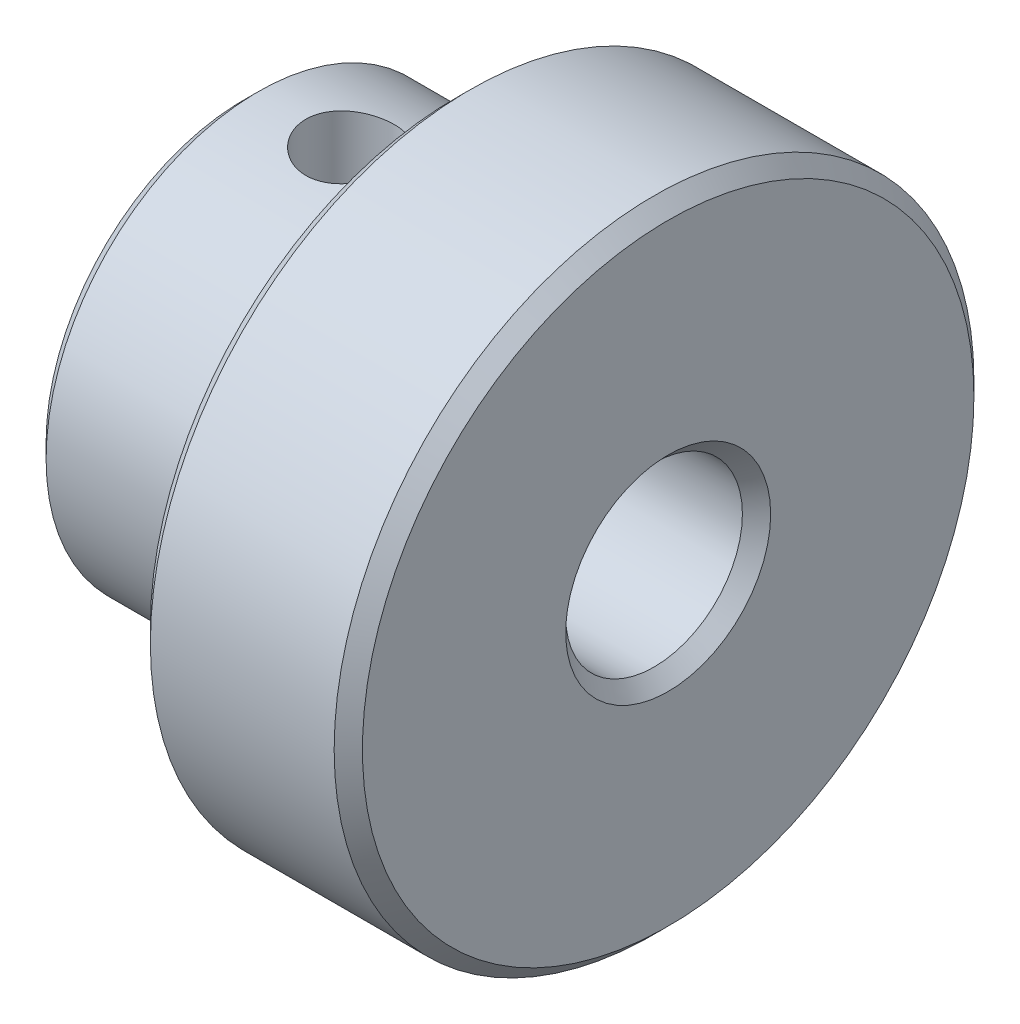
ISO-10303-21;
HEADER;
FILE_DESCRIPTION(('STEP AP214'),'2;1');
FILE_NAME('part.step','',(''),(''),'','','');
FILE_SCHEMA(('AUTOMOTIVE_DESIGN { 1 0 10303 214 1 1 1 1 }'));
ENDSEC;
DATA;
#1=APPLICATION_CONTEXT('core data for automotive mechanical design processes');
#2=APPLICATION_PROTOCOL_DEFINITION('international standard','automotive_design',2000,#1);
#3=PRODUCT_CONTEXT('',#1,'mechanical');
#4=PRODUCT('Part','Part','',(#3));
#5=PRODUCT_RELATED_PRODUCT_CATEGORY('part','',(#4));
#6=PRODUCT_DEFINITION_FORMATION('','',#4);
#7=PRODUCT_DEFINITION_CONTEXT('part definition',#1,'design');
#8=PRODUCT_DEFINITION('design','',#6,#7);
#9=PRODUCT_DEFINITION_SHAPE('','',#8);
#10=(LENGTH_UNIT() NAMED_UNIT(*) SI_UNIT(.MILLI.,.METRE.));
#11=(NAMED_UNIT(*) PLANE_ANGLE_UNIT() SI_UNIT($,.RADIAN.));
#12=(NAMED_UNIT(*) SI_UNIT($,.STERADIAN.) SOLID_ANGLE_UNIT());
#13=UNCERTAINTY_MEASURE_WITH_UNIT(LENGTH_MEASURE(1.E-05),#10,'distance_accuracy_value','');
#14=(GEOMETRIC_REPRESENTATION_CONTEXT(3) GLOBAL_UNCERTAINTY_ASSIGNED_CONTEXT((#13)) GLOBAL_UNIT_ASSIGNED_CONTEXT((#10,
#11,#12)) REPRESENTATION_CONTEXT('',''));
#15=CARTESIAN_POINT('',(0.,0.,0.));
#16=DIRECTION('',(0.,0.,1.));
#17=DIRECTION('',(1.,0.,0.));
#18=AXIS2_PLACEMENT_3D('',#15,#16,#17);
#19=CARTESIAN_POINT('',(0.,0.,6.));
#20=DIRECTION('',(-1.,0.,0.));
#21=DIRECTION('',(0.,0.,1.));
#22=AXIS2_PLACEMENT_3D('',#19,#20,#21);
#23=PLANE('',#22);
#24=CARTESIAN_POINT('',(0.,0.,0.));
#25=DIRECTION('',(-1.,0.,0.));
#26=DIRECTION('',(0.,0.,1.));
#27=AXIS2_PLACEMENT_3D('',#24,#25,#26);
#28=CIRCLE('',#27,5.6);
#29=CARTESIAN_POINT('',(0.,0.,5.6));
#30=VERTEX_POINT('',#29);
#31=EDGE_CURVE('E26',#30,#30,#28,.T.);
#32=ORIENTED_EDGE('',*,*,#31,.T.);
#33=EDGE_LOOP('',(#32));
#34=FACE_BOUND('',#33,.T.);
#35=CARTESIAN_POINT('',(0.,0.,0.));
#36=DIRECTION('',(-1.,0.,0.));
#37=DIRECTION('',(0.,0.,1.));
#38=AXIS2_PLACEMENT_3D('',#35,#36,#37);
#39=CIRCLE('',#38,2.9);
#40=CARTESIAN_POINT('',(0.,0.,2.9));
#41=VERTEX_POINT('',#40);
#42=EDGE_CURVE('E30',#41,#41,#39,.F.);
#43=ORIENTED_EDGE('',*,*,#42,.T.);
#44=EDGE_LOOP('',(#43));
#45=FACE_BOUND('',#44,.T.);
#46=ADVANCED_FACE('F14',(#34,#45),#23,.T.);
#47=CARTESIAN_POINT('',(12.,0.,0.));
#48=DIRECTION('',(1.,0.,0.));
#49=DIRECTION('',(0.,0.,-1.));
#50=AXIS2_PLACEMENT_3D('',#47,#48,#49);
#51=PLANE('',#50);
#52=CARTESIAN_POINT('',(12.,0.,0.));
#53=DIRECTION('',(1.,0.,0.));
#54=DIRECTION('',(0.,0.,-1.));
#55=AXIS2_PLACEMENT_3D('',#52,#53,#54);
#56=CIRCLE('',#55,8.65);
#57=CARTESIAN_POINT('',(12.,0.,-8.65));
#58=VERTEX_POINT('',#57);
#59=EDGE_CURVE('E41',#58,#58,#56,.T.);
#60=ORIENTED_EDGE('',*,*,#59,.T.);
#61=EDGE_LOOP('',(#60));
#62=FACE_BOUND('',#61,.T.);
#63=CARTESIAN_POINT('',(12.,0.,0.));
#64=DIRECTION('',(1.,0.,0.));
#65=DIRECTION('',(0.,0.,-1.));
#66=AXIS2_PLACEMENT_3D('',#63,#64,#65);
#67=CIRCLE('',#66,2.9);
#68=CARTESIAN_POINT('',(12.,0.,-2.9));
#69=VERTEX_POINT('',#68);
#70=EDGE_CURVE('E44',#69,#69,#67,.F.);
#71=ORIENTED_EDGE('',*,*,#70,.T.);
#72=EDGE_LOOP('',(#71));
#73=FACE_BOUND('',#72,.T.);
#74=ADVANCED_FACE('F90',(#62,#73),#51,.T.);
#75=CARTESIAN_POINT('',(0.,0.,0.));
#76=DIRECTION('',(-1.,0.,0.));
#77=DIRECTION('',(0.,0.,1.));
#78=AXIS2_PLACEMENT_3D('',#75,#76,#77);
#79=CYLINDRICAL_SURFACE('',#78,9.05);
#80=CARTESIAN_POINT('',(11.6,0.,0.));
#81=DIRECTION('',(1.,0.,0.));
#82=DIRECTION('',(0.,0.,-1.));
#83=AXIS2_PLACEMENT_3D('',#80,#81,#82);
#84=CIRCLE('',#83,9.05);
#85=CARTESIAN_POINT('',(11.6,0.,-9.05));
#86=VERTEX_POINT('',#85);
#87=EDGE_CURVE('E47',#86,#86,#84,.F.);
#88=ORIENTED_EDGE('',*,*,#87,.T.);
#89=EDGE_LOOP('',(#88));
#90=FACE_BOUND('',#89,.T.);
#91=CARTESIAN_POINT('',(6.4,0.,0.));
#92=DIRECTION('',(-1.,0.,0.));
#93=DIRECTION('',(0.,0.,1.));
#94=AXIS2_PLACEMENT_3D('',#91,#92,#93);
#95=CIRCLE('',#94,9.05);
#96=CARTESIAN_POINT('',(6.4,0.,9.05));
#97=VERTEX_POINT('',#96);
#98=EDGE_CURVE('E50',#97,#97,#95,.F.);
#99=ORIENTED_EDGE('',*,*,#98,.T.);
#100=EDGE_LOOP('',(#99));
#101=FACE_BOUND('',#100,.T.);
#102=ADVANCED_FACE('F96',(#90,#101),#79,.T.);
#103=CARTESIAN_POINT('',(6.,0.,9.05));
#104=DIRECTION('',(-1.,0.,0.));
#105=DIRECTION('',(0.,0.,1.));
#106=AXIS2_PLACEMENT_3D('',#103,#104,#105);
#107=PLANE('',#106);
#108=CARTESIAN_POINT('',(6.,0.,0.));
#109=DIRECTION('',(-1.,0.,0.));
#110=DIRECTION('',(0.,0.,1.));
#111=AXIS2_PLACEMENT_3D('',#108,#109,#110);
#112=CIRCLE('',#111,8.65);
#113=CARTESIAN_POINT('',(6.,0.,8.65));
#114=VERTEX_POINT('',#113);
#115=EDGE_CURVE('E10',#114,#114,#112,.T.);
#116=ORIENTED_EDGE('',*,*,#115,.T.);
#117=EDGE_LOOP('',(#116));
#118=FACE_BOUND('',#117,.T.);
#119=CARTESIAN_POINT('',(6.,0.,0.));
#120=DIRECTION('',(-1.,0.,0.));
#121=DIRECTION('',(0.,0.,1.));
#122=AXIS2_PLACEMENT_3D('',#119,#120,#121);
#123=CIRCLE('',#122,6.);
#124=CARTESIAN_POINT('',(6.,0.,6.));
#125=VERTEX_POINT('',#124);
#126=EDGE_CURVE('E53',#125,#125,#123,.T.);
#127=ORIENTED_EDGE('',*,*,#126,.F.);
#128=EDGE_LOOP('',(#127));
#129=FACE_BOUND('',#128,.T.);
#130=ADVANCED_FACE('F87',(#118,#129),#107,.T.);
#131=CARTESIAN_POINT('',(0.,0.,0.));
#132=DIRECTION('',(-1.,0.,0.));
#133=DIRECTION('',(0.,0.,1.));
#134=AXIS2_PLACEMENT_3D('',#131,#132,#133);
#135=CYLINDRICAL_SURFACE('',#134,6.);
#136=CARTESIAN_POINT('',(0.400000000000008,0.,0.));
#137=DIRECTION('',(-1.,0.,0.));
#138=DIRECTION('',(0.,0.,1.));
#139=AXIS2_PLACEMENT_3D('',#136,#137,#138);
#140=CIRCLE('',#139,6.);
#141=CARTESIAN_POINT('',(0.400000000000008,0.,6.));
#142=VERTEX_POINT('',#141);
#143=EDGE_CURVE('E22',#142,#142,#140,.F.);
#144=ORIENTED_EDGE('',*,*,#143,.T.);
#145=EDGE_LOOP('',(#144));
#146=FACE_BOUND('',#145,.T.);
#147=CARTESIAN_POINT('',(3.,5.86834729715275,1.25));
#148=CARTESIAN_POINT('',(3.06939061515103,5.86834869213645,1.249997508776));
#149=CARTESIAN_POINT('',(3.13881197201522,5.86959145924544,1.24420229433948));
#150=CARTESIAN_POINT('',(3.27568631731725,5.87442015581798,1.22119649233779));
#151=CARTESIAN_POINT('',(3.34313775550642,5.87800788138388,1.20397715440341));
#152=CARTESIAN_POINT('',(3.47407237283487,5.8871029296193,1.1586839750723));
#153=CARTESIAN_POINT('',(3.53755959599181,5.89260825706945,1.13062141248932));
#154=CARTESIAN_POINT('',(3.6589244996456,5.90491581335741,1.06446988601732));
#155=CARTESIAN_POINT('',(3.71680240673001,5.91171798977623,1.02638132735819));
#156=CARTESIAN_POINT('',(3.82619537515346,5.92596934661468,0.940636399466077));
#157=CARTESIAN_POINT('',(3.87761189362647,5.93342614373039,0.892855554869669));
#158=CARTESIAN_POINT('',(3.9717610686481,5.94807966802575,0.789351223880638));
#159=CARTESIAN_POINT('',(4.01449308829144,5.95527637609915,0.733627155455999));
#160=CARTESIAN_POINT('',(4.09044588808286,5.96868135118849,0.615162052999585));
#161=CARTESIAN_POINT('',(4.12357252646326,5.97487958631243,0.552359428204941));
#162=CARTESIAN_POINT('',(4.17876605285978,5.98550347343302,0.421928551006721));
#163=CARTESIAN_POINT('',(4.20083406515352,5.98992930561222,0.35430078995059));
#164=CARTESIAN_POINT('',(4.23297576111746,5.99645589892178,0.2171629042005));
#165=CARTESIAN_POINT('',(4.24321601719517,5.99858891959926,0.147693380916357));
#166=CARTESIAN_POINT('',(4.25193169575702,6.00040112580612,0.0079918488395248));
#167=CARTESIAN_POINT('',(4.2504083441931,6.0000805670369,-0.0622400797368379));
#168=CARTESIAN_POINT('',(4.23576539904325,5.99704658090511,-0.200326586199572));
#169=CARTESIAN_POINT('',(4.22282528104188,5.99437018956584,-0.268201128726476));
#170=CARTESIAN_POINT('',(4.18600137466869,5.98696720898885,-0.400793746289752));
#171=CARTESIAN_POINT('',(4.16211712279692,5.98224053291904,-0.46551168751102));
#172=CARTESIAN_POINT('',(4.10391994787449,5.97120767323924,-0.590460005384682));
#173=CARTESIAN_POINT('',(4.06953770579034,5.96489104125346,-0.650657134981651));
#174=CARTESIAN_POINT('',(3.99137199715959,5.95137300440189,-0.764493456510648));
#175=CARTESIAN_POINT('',(3.94758736179387,5.94417148958325,-0.818131831816415));
#176=CARTESIAN_POINT('',(3.85087837510894,5.92951700233276,-0.918394203276908));
#177=CARTESIAN_POINT('',(3.79779694001806,5.92206184975925,-0.964866487494795));
#178=CARTESIAN_POINT('',(3.6845179510052,5.90786872648996,-1.04827597240488));
#179=CARTESIAN_POINT('',(3.62432023861276,5.9011307717716,-1.08521296069979));
#180=CARTESIAN_POINT('',(3.4982877451712,5.88912998409156,-1.14856217138454));
#181=CARTESIAN_POINT('',(3.43243934930657,5.88387085232125,-1.17494805489727));
#182=CARTESIAN_POINT('',(3.29710838063061,5.8754760641036,-1.21623577538673));
#183=CARTESIAN_POINT('',(3.22762632719191,5.87234010507183,-1.23113924882348));
#184=CARTESIAN_POINT('',(3.08838029368109,5.86860783239133,-1.24880863867017));
#185=CARTESIAN_POINT('',(3.01864541546297,5.86796551863474,-1.25179442917998));
#186=CARTESIAN_POINT('',(2.87967418845986,5.86916952018704,-1.24613693439294));
#187=CARTESIAN_POINT('',(2.81043780909767,5.87101568152624,-1.23749436857862));
#188=CARTESIAN_POINT('',(2.67517948394188,5.87694538226167,-1.20901558325483));
#189=CARTESIAN_POINT('',(2.60913133282117,5.88100511282998,-1.18929841376871));
#190=CARTESIAN_POINT('',(2.4812760105584,5.8908833850312,-1.13935810860919));
#191=CARTESIAN_POINT('',(2.4194692143496,5.89670208191057,-1.10913404556146));
#192=CARTESIAN_POINT('',(2.30089355878377,5.90954501937191,-1.03854598181484));
#193=CARTESIAN_POINT('',(2.24420779553383,5.91658506648323,-0.998045327353962));
#194=CARTESIAN_POINT('',(2.13835675084494,5.93103483993908,-0.908234440569879));
#195=CARTESIAN_POINT('',(2.08919231376078,5.93844460766532,-0.858923220505169));
#196=CARTESIAN_POINT('',(1.99893728690284,5.95294924316736,-0.751900450843335));
#197=CARTESIAN_POINT('',(1.95799590497362,5.9600367471991,-0.694061907614552));
#198=CARTESIAN_POINT('',(1.88641124791202,5.97296708772407,-0.572200102216361));
#199=CARTESIAN_POINT('',(1.85576751776256,5.97880997920819,-0.50817711347688));
#200=CARTESIAN_POINT('',(1.80586132068266,5.98856148270679,-0.376142117847917));
#201=CARTESIAN_POINT('',(1.78653083445566,5.99248163136497,-0.308156710970194));
#202=CARTESIAN_POINT('',(1.7595855959919,5.99799561410226,-0.169813400503473));
#203=CARTESIAN_POINT('',(1.75196930646727,5.99958975342888,-0.0994558094616957));
#204=CARTESIAN_POINT('',(1.74873237795149,6.00026408056941,0.0402133434703397));
#205=CARTESIAN_POINT('',(1.75288810000527,5.99939113754811,0.109519592177923));
#206=CARTESIAN_POINT('',(1.77258063865293,5.99532874094472,0.246422870373552));
#207=CARTESIAN_POINT('',(1.78811728640678,5.99213932172839,0.314019925202701));
#208=CARTESIAN_POINT('',(1.83002779464857,5.98380460077544,0.445431965492052));
#209=CARTESIAN_POINT('',(1.85637266385311,5.97866453407556,0.509256550004525));
#210=CARTESIAN_POINT('',(1.919122397732,5.96697995347704,0.631610567220742));
#211=CARTESIAN_POINT('',(1.95552813834314,5.96043531730246,0.690139538279508));
#212=CARTESIAN_POINT('',(2.03810966799331,5.94651596786387,0.801340321298258));
#213=CARTESIAN_POINT('',(2.08444428805671,5.93912880302851,0.853892633615929));
#214=CARTESIAN_POINT('',(2.18524450099709,5.92442786811349,0.950552741980387));
#215=CARTESIAN_POINT('',(2.23971202994844,5.91711411595368,0.994658521571229));
#216=CARTESIAN_POINT('',(2.35600910243345,5.90329191643327,1.07367451852767));
#217=CARTESIAN_POINT('',(2.4179184114621,5.89679406702551,1.10846928126994));
#218=CARTESIAN_POINT('',(2.54682515608327,5.88547039658063,1.16710627925306));
#219=CARTESIAN_POINT('',(2.61381804845301,5.88064310352601,1.19095816292459));
#220=CARTESIAN_POINT('',(2.73410628156844,5.87414004405196,1.2225655413186));
#221=CARTESIAN_POINT('',(2.78672953659306,5.87198163591589,1.2328344900567));
#222=CARTESIAN_POINT('',(2.89289578052101,5.86908475266777,1.24655254358404));
#223=CARTESIAN_POINT('',(2.94643873231004,5.86834622039193,1.25000192292741));
#224=CARTESIAN_POINT('',(3.,5.86834729715275,1.25));
#225=B_SPLINE_CURVE_WITH_KNOTS('',3,(#147,#148,#149,#150,#151,#152,#153,#154,#155,#156,#157,
#158,#159,#160,#161,#162,#163,#164,#165,#166,#167,#168,#169,#170,#171,#172,#173,#174,#175,#176,
#177,#178,#179,#180,#181,#182,#183,#184,#185,#186,#187,#188,#189,#190,#191,#192,#193,#194,#195,
#196,#197,#198,#199,#200,#201,#202,#203,#204,#205,#206,#207,#208,#209,#210,#211,#212,#213,#214,
#215,#216,#217,#218,#219,#220,#221,#222,#223,#224),.UNSPECIFIED.,.T.,.F.,(4,2,2,2,2,2,2,2,2,2,2,
2,2,2,2,2,2,2,2,2,2,2,2,2,2,2,2,2,2,2,2,2,2,2,2,2,2,2,4),(0.,0.207975654071269,
0.416110792417471,0.624030014802728,0.831940834815789,1.04271333467885,1.25350128663874,
1.46629026266844,1.67905760106933,1.88879048859264,2.09850151896338,2.30497341416461,
2.5114540545587,2.71932871977949,2.92722924104259,3.13905862244913,3.35089272191627,
3.56325237332487,3.77558175387596,3.98397516009791,4.19235567296523,4.39853786231922,
4.6047382546403,4.8138391793465,5.02296356082185,5.23559458753342,5.44821621759039,
5.65954599648533,5.8708480395958,6.07816293922643,6.2854747633298,6.492234105851,
6.69901145528172,6.90938318978572,7.11980508427534,7.33272651358122,7.54545984571987,
7.70599867585768,7.86653104261159),.UNSPECIFIED.);
#226=CARTESIAN_POINT('',(3.,5.86834729715275,1.25));
#227=VERTEX_POINT('',#226);
#228=EDGE_CURVE('E56',#227,#227,#225,.T.);
#229=ORIENTED_EDGE('',*,*,#228,.F.);
#230=EDGE_LOOP('',(#229));
#231=FACE_BOUND('',#230,.T.);
#232=ORIENTED_EDGE('',*,*,#126,.T.);
#233=EDGE_LOOP('',(#232));
#234=FACE_BOUND('',#233,.T.);
#235=ADVANCED_FACE('F69',(#146,#231,#234),#135,.T.);
#236=CARTESIAN_POINT('',(12.,0.,0.));
#237=DIRECTION('',(-1.,0.,0.));
#238=DIRECTION('',(0.,0.,1.));
#239=AXIS2_PLACEMENT_3D('',#236,#237,#238);
#240=CYLINDRICAL_SURFACE('',#239,2.5);
#241=CARTESIAN_POINT('',(11.6,0.,0.));
#242=DIRECTION('',(1.,0.,0.));
#243=DIRECTION('',(0.,0.,-1.));
#244=AXIS2_PLACEMENT_3D('',#241,#242,#243);
#245=CIRCLE('',#244,2.5);
#246=CARTESIAN_POINT('',(11.6,0.,-2.5));
#247=VERTEX_POINT('',#246);
#248=EDGE_CURVE('E35',#247,#247,#245,.T.);
#249=ORIENTED_EDGE('',*,*,#248,.T.);
#250=EDGE_LOOP('',(#249));
#251=FACE_BOUND('',#250,.T.);
#252=CARTESIAN_POINT('',(0.400000000000019,0.,0.));
#253=DIRECTION('',(-1.,0.,0.));
#254=DIRECTION('',(0.,0.,1.));
#255=AXIS2_PLACEMENT_3D('',#252,#253,#254);
#256=CIRCLE('',#255,2.5);
#257=CARTESIAN_POINT('',(0.400000000000019,0.,2.5));
#258=VERTEX_POINT('',#257);
#259=EDGE_CURVE('E38',#258,#258,#256,.T.);
#260=ORIENTED_EDGE('',*,*,#259,.T.);
#261=EDGE_LOOP('',(#260));
#262=FACE_BOUND('',#261,.T.);
#263=CARTESIAN_POINT('',(3.,2.1650635094611,1.25));
#264=CARTESIAN_POINT('',(3.06513476024406,2.16506918410574,1.24999545384316));
#265=CARTESIAN_POINT('',(3.13035176440631,2.16804751484696,1.24487496341652));
#266=CARTESIAN_POINT('',(3.25878408084644,2.17952958065065,1.22465401237257));
#267=CARTESIAN_POINT('',(3.32199489380426,2.18804492569449,1.20953258069272));
#268=CARTESIAN_POINT('',(3.44431458042993,2.20936683256748,1.17012493587476));
#269=CARTESIAN_POINT('',(3.50344331559199,2.22215054341565,1.14588744061716));
#270=CARTESIAN_POINT('',(3.6167802524959,2.25053331021072,1.08908440672046));
#271=CARTESIAN_POINT('',(3.67098818782807,2.26613251845081,1.05651841754471));
#272=CARTESIAN_POINT('',(3.77788216069688,2.29996086321802,0.980833175663593));
#273=CARTESIAN_POINT('',(3.83007391959193,2.31830079547442,0.937065045179712));
#274=CARTESIAN_POINT('',(3.92676048550839,2.35464978482132,0.841567259518085));
#275=CARTESIAN_POINT('',(3.97125145322939,2.37265867289062,0.789833657227861));
#276=CARTESIAN_POINT('',(4.05420893893457,2.40776846191186,0.675611954268177));
#277=CARTESIAN_POINT('',(4.09206720982441,2.42472633022716,0.612633986265717));
#278=CARTESIAN_POINT('',(4.1564260665572,2.45438445124411,0.48019628324938));
#279=CARTESIAN_POINT('',(4.18293382017145,2.46708738979677,0.41074067267269));
#280=CARTESIAN_POINT('',(4.22188082662636,2.48600576555297,0.272556179907467));
#281=CARTESIAN_POINT('',(4.23518690794442,2.49261850276115,0.204127238111019));
#282=CARTESIAN_POINT('',(4.2502076483438,2.50009479807584,0.0657132858723093));
#283=CARTESIAN_POINT('',(4.25192932099463,2.50096183480737,-0.00427075730467391));
#284=CARTESIAN_POINT('',(4.24406665753706,2.49703727395563,-0.137290655529688));
#285=CARTESIAN_POINT('',(4.23545248059847,2.49273119865201,-0.200401498970991));
#286=CARTESIAN_POINT('',(4.20889894511918,2.47967806574684,-0.324142214897903));
#287=CARTESIAN_POINT('',(4.19095888877972,2.47093067582992,-0.384771901367405));
#288=CARTESIAN_POINT('',(4.14614679238773,2.44964479109568,-0.502886739461941));
#289=CARTESIAN_POINT('',(4.11915460853492,2.43705551911499,-0.560316779393974));
#290=CARTESIAN_POINT('',(4.05717072974813,2.40922057483359,-0.669971001891661));
#291=CARTESIAN_POINT('',(4.02217617087206,2.39397395196855,-0.722193311048304));
#292=CARTESIAN_POINT('',(3.94138081058373,2.36055492999037,-0.825217076122741));
#293=CARTESIAN_POINT('',(3.89487121459249,2.34224219997719,-0.875417593786701));
#294=CARTESIAN_POINT('',(3.79426284383728,2.30567925733515,-0.967630462872224));
#295=CARTESIAN_POINT('',(3.74015828465742,2.28742910332036,-1.00963651446778));
#296=CARTESIAN_POINT('',(3.62168975946989,2.25180195115606,-1.08688166830276));
#297=CARTESIAN_POINT('',(3.55689247118224,2.23455399988384,-1.12152164372257));
#298=CARTESIAN_POINT('',(3.42132791080125,2.2046931284822,-1.17914889125154));
#299=CARTESIAN_POINT('',(3.35056695872804,2.19207537557585,-1.2021483227636));
#300=CARTESIAN_POINT('',(3.21098186089651,2.17430794771293,-1.23397526378129));
#301=CARTESIAN_POINT('',(3.14244860119556,2.1686456981062,-1.24378140264997));
#302=CARTESIAN_POINT('',(3.00449832310432,2.16397399202012,-1.25189618326428));
#303=CARTESIAN_POINT('',(2.93508196360027,2.1649598361164,-1.25021294664377));
#304=CARTESIAN_POINT('',(2.80543260177659,2.17292920675731,-1.23629505417995));
#305=CARTESIAN_POINT('',(2.74502568611509,2.17924484383318,-1.22523477089058));
#306=CARTESIAN_POINT('',(2.6270402671613,2.19617526939176,-1.19462035579055));
#307=CARTESIAN_POINT('',(2.56946268656674,2.20679145006293,-1.17506347327951));
#308=CARTESIAN_POINT('',(2.45573583637163,2.23170277599571,-1.1270594857561));
#309=CARTESIAN_POINT('',(2.39977622893306,2.24614554053829,-1.0982425796159));
#310=CARTESIAN_POINT('',(2.29316341057626,2.27695149371562,-1.03285883001975));
#311=CARTESIAN_POINT('',(2.2425129456084,2.29331566693934,-0.996288005415263));
#312=CARTESIAN_POINT('',(2.14127654059557,2.3285999807042,-0.911046458998559));
#313=CARTESIAN_POINT('',(2.09150356160292,2.34758228942861,-0.861431590393705));
#314=CARTESIAN_POINT('',(2.00073470250801,2.38417793722366,-0.754255619247859));
#315=CARTESIAN_POINT('',(1.95974178721183,2.40179081259637,-0.696691843319178));
#316=CARTESIAN_POINT('',(1.88678284256238,2.43426702113696,-0.573169203198439));
#317=CARTESIAN_POINT('',(1.85508360223636,2.44904552090037,-0.507028871967637));
#318=CARTESIAN_POINT('',(1.80357762017826,2.47354193699126,-0.36940295580135));
#319=CARTESIAN_POINT('',(1.78376043579212,2.48326429595466,-0.297922126740216));
#320=CARTESIAN_POINT('',(1.75828929478168,2.49584385227353,-0.158724602913017));
#321=CARTESIAN_POINT('',(1.75150265515486,2.49924909885239,-0.0912643048130676));
#322=CARTESIAN_POINT('',(1.748945918182,2.50052662968914,0.043907482439007));
#323=CARTESIAN_POINT('',(1.75317196434555,2.49840085083612,0.11161887536886));
#324=CARTESIAN_POINT('',(1.77177050849454,2.48917461047403,0.240672490396436));
#325=CARTESIAN_POINT('',(1.78545606157209,2.48241118334987,0.302140397264083));
#326=CARTESIAN_POINT('',(1.82165874912871,2.46490117079279,0.421807440229525));
#327=CARTESIAN_POINT('',(1.84417715011682,2.45415401415995,0.480006106194387));
#328=CARTESIAN_POINT('',(1.89840881520747,2.4290741343515,0.594279257806107));
#329=CARTESIAN_POINT('',(1.9304741540098,2.41460771498499,0.650156428375061));
#330=CARTESIAN_POINT('',(2.00244741357381,2.38360166427282,0.755968302267533));
#331=CARTESIAN_POINT('',(2.0423589363946,2.36706108197951,0.805900259268632));
#332=CARTESIAN_POINT('',(2.13349642377838,2.33160762783285,0.903642505196113));
#333=CARTESIAN_POINT('',(2.18545310934649,2.31262248764622,0.950747105674093));
#334=CARTESIAN_POINT('',(2.29681340141222,2.27578845203565,1.03582910924334));
#335=CARTESIAN_POINT('',(2.35622352608461,2.25794057202332,1.07379843751257));
#336=CARTESIAN_POINT('',(2.4832958082262,2.22499506631145,1.14053884973206));
#337=CARTESIAN_POINT('',(2.55115941391092,2.21000217820338,1.16898133245118));
#338=CARTESIAN_POINT('',(2.69166550542472,2.1858269541044,1.21359838688301));
#339=CARTESIAN_POINT('',(2.76429111114086,2.17662520184628,1.22981398896917));
#340=CARTESIAN_POINT('',(2.864756694565,2.16911590752238,1.24295875983051));
#341=CARTESIAN_POINT('',(2.89170986799736,2.1676016125644,1.24559513120481));
#342=CARTESIAN_POINT('',(2.9457706008528,2.16557419859688,1.24911675636246));
#343=CARTESIAN_POINT('',(2.97287817048234,2.16506114656387,1.25000189299984));
#344=CARTESIAN_POINT('',(3.,2.1650635094611,1.25));
#345=B_SPLINE_CURVE_WITH_KNOTS('',3,(#263,#264,#265,#266,#267,#268,#269,#270,#271,#272,#273,
#274,#275,#276,#277,#278,#279,#280,#281,#282,#283,#284,#285,#286,#287,#288,#289,#290,#291,#292,
#293,#294,#295,#296,#297,#298,#299,#300,#301,#302,#303,#304,#305,#306,#307,#308,#309,#310,#311,
#312,#313,#314,#315,#316,#317,#318,#319,#320,#321,#322,#323,#324,#325,#326,#327,#328,#329,#330,
#331,#332,#333,#334,#335,#336,#337,#338,#339,#340,#341,#342,#343,#344),.UNSPECIFIED.,.T.,.F.,(4,
2,2,2,2,2,2,2,2,2,2,2,2,2,2,2,2,2,2,2,2,2,2,2,2,2,2,2,2,2,2,2,2,2,2,2,2,2,2,2,4),(0.,
0.195290153243394,0.390991116031006,0.585660744898608,0.780340906806437,0.991077890622791,
1.20191963855463,1.42697365298454,1.65188533704864,1.86079356209919,2.0695752960755,
2.26020121855672,2.45084140646818,2.64411918413933,2.83746624187839,3.04908989321113,
3.26087560307397,3.4861105216181,3.7111096776463,3.91827863567764,4.12530116485465,
4.30967729280031,4.49411315545078,4.68709120507609,4.88016857775058,5.09758429475765,
5.31507331222752,5.53830226766206,5.76133474760963,5.96390337986857,6.16640108492463,
6.35555531089364,6.54473666890015,6.74200938399338,6.93937287625897,7.15637802312583,
7.37357428556441,7.59763436298254,7.82093916253448,7.90225168981635,7.98356965618173),.UNSPECIFIED.);
#346=CARTESIAN_POINT('',(3.,2.1650635094611,1.25));
#347=VERTEX_POINT('',#346);
#348=EDGE_CURVE('E64',#347,#347,#345,.T.);
#349=ORIENTED_EDGE('',*,*,#348,.T.);
#350=EDGE_LOOP('',(#349));
#351=FACE_BOUND('',#350,.T.);
#352=ADVANCED_FACE('F77',(#251,#262,#351),#240,.F.);
#353=CARTESIAN_POINT('',(3.,6.,0.));
#354=DIRECTION('',(0.,1.,0.));
#355=DIRECTION('',(0.,0.,1.));
#356=AXIS2_PLACEMENT_3D('',#353,#354,#355);
#357=CYLINDRICAL_SURFACE('',#356,1.25);
#358=ORIENTED_EDGE('',*,*,#228,.T.);
#359=EDGE_LOOP('',(#358));
#360=FACE_BOUND('',#359,.T.);
#361=ORIENTED_EDGE('',*,*,#348,.F.);
#362=EDGE_LOOP('',(#361));
#363=FACE_BOUND('',#362,.T.);
#364=ADVANCED_FACE('F73',(#360,#363),#357,.F.);
#365=CARTESIAN_POINT('',(11.6,0.,0.));
#366=DIRECTION('',(-1.,0.,0.));
#367=DIRECTION('',(0.,0.,1.));
#368=AXIS2_PLACEMENT_3D('',#365,#366,#367);
#369=CONICAL_SURFACE('',#368,9.05,0.785398163397448);
#370=ORIENTED_EDGE('',*,*,#59,.F.);
#371=EDGE_LOOP('',(#370));
#372=FACE_BOUND('',#371,.T.);
#373=ORIENTED_EDGE('',*,*,#87,.F.);
#374=EDGE_LOOP('',(#373));
#375=FACE_BOUND('',#374,.T.);
#376=ADVANCED_FACE('F76',(#372,#375),#369,.T.);
#377=CARTESIAN_POINT('',(12.,0.,0.));
#378=DIRECTION('',(1.,0.,0.));
#379=DIRECTION('',(0.,0.,-1.));
#380=AXIS2_PLACEMENT_3D('',#377,#378,#379);
#381=CONICAL_SURFACE('',#380,2.9,0.785398163397446);
#382=ORIENTED_EDGE('',*,*,#248,.F.);
#383=EDGE_LOOP('',(#382));
#384=FACE_BOUND('',#383,.T.);
#385=ORIENTED_EDGE('',*,*,#70,.F.);
#386=EDGE_LOOP('',(#385));
#387=FACE_BOUND('',#386,.T.);
#388=ADVANCED_FACE('F109',(#384,#387),#381,.F.);
#389=CARTESIAN_POINT('',(0.,0.,0.));
#390=DIRECTION('',(1.,0.,0.));
#391=DIRECTION('',(0.,0.,-1.));
#392=AXIS2_PLACEMENT_3D('',#389,#390,#391);
#393=CONICAL_SURFACE('',#392,5.6,0.785398163397446);
#394=ORIENTED_EDGE('',*,*,#143,.F.);
#395=EDGE_LOOP('',(#394));
#396=FACE_BOUND('',#395,.T.);
#397=ORIENTED_EDGE('',*,*,#31,.F.);
#398=EDGE_LOOP('',(#397));
#399=FACE_BOUND('',#398,.T.);
#400=ADVANCED_FACE('F116',(#396,#399),#393,.T.);
#401=CARTESIAN_POINT('',(0.400000000000019,0.,0.));
#402=DIRECTION('',(-1.,0.,0.));
#403=DIRECTION('',(0.,0.,1.));
#404=AXIS2_PLACEMENT_3D('',#401,#402,#403);
#405=CONICAL_SURFACE('',#404,2.5,0.78539816339745);
#406=ORIENTED_EDGE('',*,*,#42,.F.);
#407=EDGE_LOOP('',(#406));
#408=FACE_BOUND('',#407,.T.);
#409=ORIENTED_EDGE('',*,*,#259,.F.);
#410=EDGE_LOOP('',(#409));
#411=FACE_BOUND('',#410,.T.);
#412=ADVANCED_FACE('F122',(#408,#411),#405,.F.);
#413=CARTESIAN_POINT('',(6.,0.,0.));
#414=DIRECTION('',(1.,0.,0.));
#415=DIRECTION('',(0.,0.,-1.));
#416=AXIS2_PLACEMENT_3D('',#413,#414,#415);
#417=CONICAL_SURFACE('',#416,8.65,0.785398163397446);
#418=ORIENTED_EDGE('',*,*,#98,.F.);
#419=EDGE_LOOP('',(#418));
#420=FACE_BOUND('',#419,.T.);
#421=ORIENTED_EDGE('',*,*,#115,.F.);
#422=EDGE_LOOP('',(#421));
#423=FACE_BOUND('',#422,.T.);
#424=ADVANCED_FACE('F17',(#420,#423),#417,.T.);
#425=CLOSED_SHELL('',(#46,#74,#102,#130,#235,#352,#364,#376,#388,#400,#412,#424));
#426=MANIFOLD_SOLID_BREP('B1',#425);
#427=ADVANCED_BREP_SHAPE_REPRESENTATION('',(#18,#426),#14);
#428=SHAPE_DEFINITION_REPRESENTATION(#9,#427);
ENDSEC;
END-ISO-10303-21;
